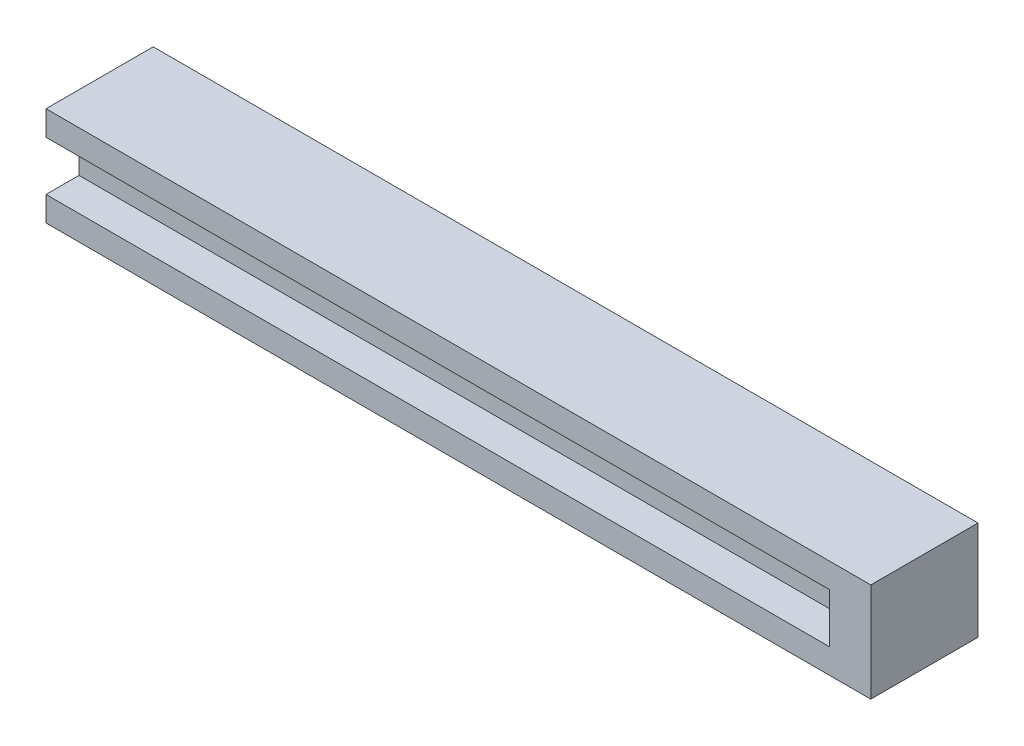
ISO-10303-21;
HEADER;
FILE_DESCRIPTION(('STEP AP214'),'2;1');
FILE_NAME('part.step','',(''),(''),'','','');
FILE_SCHEMA(('AUTOMOTIVE_DESIGN { 1 0 10303 214 1 1 1 1 }'));
ENDSEC;
DATA;
#1=APPLICATION_CONTEXT('core data for automotive mechanical design processes');
#2=APPLICATION_PROTOCOL_DEFINITION('international standard','automotive_design',2000,#1);
#3=PRODUCT_CONTEXT('',#1,'mechanical');
#4=PRODUCT('Part','Part','',(#3));
#5=PRODUCT_RELATED_PRODUCT_CATEGORY('part','',(#4));
#6=PRODUCT_DEFINITION_FORMATION('','',#4);
#7=PRODUCT_DEFINITION_CONTEXT('part definition',#1,'design');
#8=PRODUCT_DEFINITION('design','',#6,#7);
#9=PRODUCT_DEFINITION_SHAPE('','',#8);
#10=(LENGTH_UNIT() NAMED_UNIT(*) SI_UNIT(.MILLI.,.METRE.));
#11=(NAMED_UNIT(*) PLANE_ANGLE_UNIT() SI_UNIT($,.RADIAN.));
#12=(NAMED_UNIT(*) SI_UNIT($,.STERADIAN.) SOLID_ANGLE_UNIT());
#13=UNCERTAINTY_MEASURE_WITH_UNIT(LENGTH_MEASURE(1.E-05),#10,'distance_accuracy_value','');
#14=(GEOMETRIC_REPRESENTATION_CONTEXT(3) GLOBAL_UNCERTAINTY_ASSIGNED_CONTEXT((#13)) GLOBAL_UNIT_ASSIGNED_CONTEXT((#10,
#11,#12)) REPRESENTATION_CONTEXT('',''));
#15=CARTESIAN_POINT('',(0.,0.,0.));
#16=DIRECTION('',(0.,0.,1.));
#17=DIRECTION('',(1.,0.,0.));
#18=AXIS2_PLACEMENT_3D('',#15,#16,#17);
#19=CARTESIAN_POINT('',(0.,0.,0.));
#20=DIRECTION('',(0.,0.,1.));
#21=DIRECTION('',(1.,0.,0.));
#22=AXIS2_PLACEMENT_3D('',#19,#20,#21);
#23=PLANE('',#22);
#24=DIRECTION('',(-1.,0.,0.));
#25=VECTOR('',#24,1.);
#26=CARTESIAN_POINT('',(45.,2.99999999999999,0.));
#27=LINE('',#26,#25);
#28=CARTESIAN_POINT('',(45.,2.99999999999999,0.));
#29=VERTEX_POINT('',#28);
#30=CARTESIAN_POINT('',(-50.,2.99999999999999,0.));
#31=VERTEX_POINT('',#30);
#32=EDGE_CURVE('E57',#29,#31,#27,.T.);
#33=ORIENTED_EDGE('',*,*,#32,.F.);
#34=DIRECTION('',(0.,1.,0.));
#35=VECTOR('',#34,1.);
#36=CARTESIAN_POINT('',(45.,-3.,0.));
#37=LINE('',#36,#35);
#38=CARTESIAN_POINT('',(45.,-3.,0.));
#39=VERTEX_POINT('',#38);
#40=EDGE_CURVE('E257',#39,#29,#37,.T.);
#41=ORIENTED_EDGE('',*,*,#40,.F.);
#42=DIRECTION('',(1.,0.,0.));
#43=VECTOR('',#42,1.);
#44=CARTESIAN_POINT('',(-50.,-3.,0.));
#45=LINE('',#44,#43);
#46=CARTESIAN_POINT('',(-50.,-3.,0.));
#47=VERTEX_POINT('',#46);
#48=EDGE_CURVE('E62',#47,#39,#45,.T.);
#49=ORIENTED_EDGE('',*,*,#48,.F.);
#50=DIRECTION('',(0.,-1.,0.));
#51=VECTOR('',#50,1.);
#52=CARTESIAN_POINT('',(-50.,6.,0.));
#53=LINE('',#52,#51);
#54=EDGE_CURVE('E153',#31,#47,#53,.T.);
#55=ORIENTED_EDGE('',*,*,#54,.F.);
#56=EDGE_LOOP('',(#33,#41,#49,#55));
#57=FACE_BOUND('',#56,.T.);
#58=ADVANCED_FACE('F41',(#57),#23,.F.);
#59=CARTESIAN_POINT('',(50.,6.,5.));
#60=DIRECTION('',(-1.,0.,0.));
#61=DIRECTION('',(0.,0.,1.));
#62=AXIS2_PLACEMENT_3D('',#59,#60,#61);
#63=PLANE('',#62);
#64=DIRECTION('',(0.,0.,-1.));
#65=VECTOR('',#64,1.);
#66=CARTESIAN_POINT('',(50.,-6.,5.));
#67=LINE('',#66,#65);
#68=CARTESIAN_POINT('',(50.,-6.,9.));
#69=VERTEX_POINT('',#68);
#70=CARTESIAN_POINT('',(50.,-6.,-4.));
#71=VERTEX_POINT('',#70);
#72=EDGE_CURVE('E220',#69,#71,#67,.T.);
#73=ORIENTED_EDGE('',*,*,#72,.T.);
#74=DIRECTION('',(0.,-1.,0.));
#75=VECTOR('',#74,1.);
#76=CARTESIAN_POINT('',(50.,6.,-4.));
#77=LINE('',#76,#75);
#78=CARTESIAN_POINT('',(50.,6.,-4.));
#79=VERTEX_POINT('',#78);
#80=EDGE_CURVE('E246',#79,#71,#77,.T.);
#81=ORIENTED_EDGE('',*,*,#80,.F.);
#82=DIRECTION('',(0.,0.,-1.));
#83=VECTOR('',#82,1.);
#84=CARTESIAN_POINT('',(50.,6.,5.));
#85=LINE('',#84,#83);
#86=CARTESIAN_POINT('',(50.,6.,9.));
#87=VERTEX_POINT('',#86);
#88=EDGE_CURVE('E11',#87,#79,#85,.T.);
#89=ORIENTED_EDGE('',*,*,#88,.F.);
#90=DIRECTION('',(0.,1.,0.));
#91=VECTOR('',#90,1.);
#92=CARTESIAN_POINT('',(50.,-6.,9.));
#93=LINE('',#92,#91);
#94=EDGE_CURVE('E170',#69,#87,#93,.T.);
#95=ORIENTED_EDGE('',*,*,#94,.F.);
#96=EDGE_LOOP('',(#73,#81,#89,#95));
#97=FACE_BOUND('',#96,.T.);
#98=ADVANCED_FACE('F43',(#97),#63,.F.);
#99=CARTESIAN_POINT('',(-50.,6.,5.));
#100=DIRECTION('',(0.,-1.,0.));
#101=DIRECTION('',(0.,0.,-1.));
#102=AXIS2_PLACEMENT_3D('',#99,#100,#101);
#103=PLANE('',#102);
#104=ORIENTED_EDGE('',*,*,#88,.T.);
#105=DIRECTION('',(1.,0.,0.));
#106=VECTOR('',#105,1.);
#107=CARTESIAN_POINT('',(-50.,6.,-4.));
#108=LINE('',#107,#106);
#109=CARTESIAN_POINT('',(-50.,6.,-4.));
#110=VERTEX_POINT('',#109);
#111=EDGE_CURVE('E237',#110,#79,#108,.T.);
#112=ORIENTED_EDGE('',*,*,#111,.F.);
#113=DIRECTION('',(0.,0.,-1.));
#114=VECTOR('',#113,1.);
#115=CARTESIAN_POINT('',(-50.,6.,5.));
#116=LINE('',#115,#114);
#117=CARTESIAN_POINT('',(-50.,6.,9.));
#118=VERTEX_POINT('',#117);
#119=EDGE_CURVE('E50',#118,#110,#116,.T.);
#120=ORIENTED_EDGE('',*,*,#119,.F.);
#121=DIRECTION('',(-1.,0.,0.));
#122=VECTOR('',#121,1.);
#123=CARTESIAN_POINT('',(50.,6.,9.));
#124=LINE('',#123,#122);
#125=EDGE_CURVE('E175',#87,#118,#124,.T.);
#126=ORIENTED_EDGE('',*,*,#125,.F.);
#127=EDGE_LOOP('',(#104,#112,#120,#126));
#128=FACE_BOUND('',#127,.T.);
#129=ADVANCED_FACE('F244',(#128),#103,.F.);
#130=CARTESIAN_POINT('',(-50.,6.,5.));
#131=DIRECTION('',(1.,0.,0.));
#132=DIRECTION('',(0.,0.,-1.));
#133=AXIS2_PLACEMENT_3D('',#130,#131,#132);
#134=PLANE('',#133);
#135=ORIENTED_EDGE('',*,*,#119,.T.);
#136=DIRECTION('',(0.,1.,0.));
#137=VECTOR('',#136,1.);
#138=CARTESIAN_POINT('',(-50.,2.99999999999999,-4.));
#139=LINE('',#138,#137);
#140=CARTESIAN_POINT('',(-50.,2.99999999999999,-4.));
#141=VERTEX_POINT('',#140);
#142=EDGE_CURVE('E231',#141,#110,#139,.T.);
#143=ORIENTED_EDGE('',*,*,#142,.F.);
#144=DIRECTION('',(0.,0.,1.));
#145=VECTOR('',#144,1.);
#146=CARTESIAN_POINT('',(-50.,2.99999999999999,-4.));
#147=LINE('',#146,#145);
#148=EDGE_CURVE('E254',#141,#31,#147,.T.);
#149=ORIENTED_EDGE('',*,*,#148,.T.);
#150=ORIENTED_EDGE('',*,*,#54,.T.);
#151=DIRECTION('',(0.,0.,1.));
#152=VECTOR('',#151,1.);
#153=CARTESIAN_POINT('',(-50.,-3.,-4.));
#154=LINE('',#153,#152);
#155=CARTESIAN_POINT('',(-50.,-3.,-4.));
#156=VERTEX_POINT('',#155);
#157=EDGE_CURVE('E133',#156,#47,#154,.T.);
#158=ORIENTED_EDGE('',*,*,#157,.F.);
#159=DIRECTION('',(0.,1.,0.));
#160=VECTOR('',#159,1.);
#161=CARTESIAN_POINT('',(-50.,-6.,-4.));
#162=LINE('',#161,#160);
#163=CARTESIAN_POINT('',(-50.,-6.,-4.));
#164=VERTEX_POINT('',#163);
#165=EDGE_CURVE('E140',#164,#156,#162,.T.);
#166=ORIENTED_EDGE('',*,*,#165,.F.);
#167=DIRECTION('',(0.,0.,-1.));
#168=VECTOR('',#167,1.);
#169=CARTESIAN_POINT('',(-50.,-6.,5.));
#170=LINE('',#169,#168);
#171=CARTESIAN_POINT('',(-50.,-6.,9.));
#172=VERTEX_POINT('',#171);
#173=EDGE_CURVE('E225',#172,#164,#170,.T.);
#174=ORIENTED_EDGE('',*,*,#173,.F.);
#175=DIRECTION('',(0.,-1.,0.));
#176=VECTOR('',#175,1.);
#177=CARTESIAN_POINT('',(-50.,-3.,9.));
#178=LINE('',#177,#176);
#179=CARTESIAN_POINT('',(-50.,-3.,9.));
#180=VERTEX_POINT('',#179);
#181=EDGE_CURVE('E191',#180,#172,#178,.T.);
#182=ORIENTED_EDGE('',*,*,#181,.F.);
#183=DIRECTION('',(0.,0.,-1.));
#184=VECTOR('',#183,1.);
#185=CARTESIAN_POINT('',(-50.,-3.,9.));
#186=LINE('',#185,#184);
#187=CARTESIAN_POINT('',(-50.,-3.,5.));
#188=VERTEX_POINT('',#187);
#189=EDGE_CURVE('E194',#180,#188,#186,.T.);
#190=ORIENTED_EDGE('',*,*,#189,.T.);
#191=DIRECTION('',(0.,-1.,0.));
#192=VECTOR('',#191,1.);
#193=CARTESIAN_POINT('',(-50.,6.,5.));
#194=LINE('',#193,#192);
#195=CARTESIAN_POINT('',(-50.,2.99999999999999,5.));
#196=VERTEX_POINT('',#195);
#197=EDGE_CURVE('E217',#196,#188,#194,.T.);
#198=ORIENTED_EDGE('',*,*,#197,.F.);
#199=DIRECTION('',(0.,0.,-1.));
#200=VECTOR('',#199,1.);
#201=CARTESIAN_POINT('',(-50.,2.99999999999999,9.));
#202=LINE('',#201,#200);
#203=CARTESIAN_POINT('',(-50.,2.99999999999999,9.));
#204=VERTEX_POINT('',#203);
#205=EDGE_CURVE('E213',#204,#196,#202,.T.);
#206=ORIENTED_EDGE('',*,*,#205,.F.);
#207=DIRECTION('',(0.,-1.,0.));
#208=VECTOR('',#207,1.);
#209=CARTESIAN_POINT('',(-50.,6.,9.));
#210=LINE('',#209,#208);
#211=EDGE_CURVE('E179',#118,#204,#210,.T.);
#212=ORIENTED_EDGE('',*,*,#211,.F.);
#213=EDGE_LOOP('',(#135,#143,#149,#150,#158,#166,#174,#182,#190,#198,#206,#212));
#214=FACE_BOUND('',#213,.T.);
#215=ADVANCED_FACE('F151',(#214),#134,.F.);
#216=CARTESIAN_POINT('',(-50.,-6.,5.));
#217=DIRECTION('',(0.,1.,0.));
#218=DIRECTION('',(0.,0.,1.));
#219=AXIS2_PLACEMENT_3D('',#216,#217,#218);
#220=PLANE('',#219);
#221=ORIENTED_EDGE('',*,*,#173,.T.);
#222=DIRECTION('',(-1.,0.,0.));
#223=VECTOR('',#222,1.);
#224=CARTESIAN_POINT('',(50.,-6.,-4.));
#225=LINE('',#224,#223);
#226=EDGE_CURVE('E147',#71,#164,#225,.T.);
#227=ORIENTED_EDGE('',*,*,#226,.F.);
#228=ORIENTED_EDGE('',*,*,#72,.F.);
#229=DIRECTION('',(1.,0.,0.));
#230=VECTOR('',#229,1.);
#231=CARTESIAN_POINT('',(-50.,-6.,9.));
#232=LINE('',#231,#230);
#233=EDGE_CURVE('E166',#172,#69,#232,.T.);
#234=ORIENTED_EDGE('',*,*,#233,.F.);
#235=EDGE_LOOP('',(#221,#227,#228,#234));
#236=FACE_BOUND('',#235,.T.);
#237=ADVANCED_FACE('F282',(#236),#220,.F.);
#238=CARTESIAN_POINT('',(0.,0.,5.));
#239=DIRECTION('',(0.,0.,1.));
#240=DIRECTION('',(1.,0.,0.));
#241=AXIS2_PLACEMENT_3D('',#238,#239,#240);
#242=PLANE('',#241);
#243=DIRECTION('',(-1.,0.,0.));
#244=VECTOR('',#243,1.);
#245=CARTESIAN_POINT('',(-50.,-3.,5.));
#246=LINE('',#245,#244);
#247=CARTESIAN_POINT('',(45.,-3.,5.));
#248=VERTEX_POINT('',#247);
#249=EDGE_CURVE('E171',#248,#188,#246,.T.);
#250=ORIENTED_EDGE('',*,*,#249,.F.);
#251=DIRECTION('',(0.,-1.,0.));
#252=VECTOR('',#251,1.);
#253=CARTESIAN_POINT('',(45.,2.99999999999999,5.));
#254=LINE('',#253,#252);
#255=CARTESIAN_POINT('',(45.,2.99999999999999,5.));
#256=VERTEX_POINT('',#255);
#257=EDGE_CURVE('E160',#256,#248,#254,.T.);
#258=ORIENTED_EDGE('',*,*,#257,.F.);
#259=DIRECTION('',(1.,0.,0.));
#260=VECTOR('',#259,1.);
#261=CARTESIAN_POINT('',(-50.,2.99999999999999,5.));
#262=LINE('',#261,#260);
#263=EDGE_CURVE('E155',#196,#256,#262,.T.);
#264=ORIENTED_EDGE('',*,*,#263,.F.);
#265=ORIENTED_EDGE('',*,*,#197,.T.);
#266=EDGE_LOOP('',(#250,#258,#264,#265));
#267=FACE_BOUND('',#266,.T.);
#268=ADVANCED_FACE('F280',(#267),#242,.T.);
#269=CARTESIAN_POINT('',(-50.,2.99999999999999,9.));
#270=DIRECTION('',(0.,1.,0.));
#271=DIRECTION('',(0.,0.,1.));
#272=AXIS2_PLACEMENT_3D('',#269,#270,#271);
#273=PLANE('',#272);
#274=ORIENTED_EDGE('',*,*,#263,.T.);
#275=DIRECTION('',(0.,0.,-1.));
#276=VECTOR('',#275,1.);
#277=CARTESIAN_POINT('',(45.,2.99999999999999,9.));
#278=LINE('',#277,#276);
#279=CARTESIAN_POINT('',(45.,2.99999999999999,9.));
#280=VERTEX_POINT('',#279);
#281=EDGE_CURVE('E209',#280,#256,#278,.T.);
#282=ORIENTED_EDGE('',*,*,#281,.F.);
#283=DIRECTION('',(1.,0.,0.));
#284=VECTOR('',#283,1.);
#285=CARTESIAN_POINT('',(-50.,2.99999999999999,9.));
#286=LINE('',#285,#284);
#287=EDGE_CURVE('E182',#204,#280,#286,.T.);
#288=ORIENTED_EDGE('',*,*,#287,.F.);
#289=ORIENTED_EDGE('',*,*,#205,.T.);
#290=EDGE_LOOP('',(#274,#282,#288,#289));
#291=FACE_BOUND('',#290,.T.);
#292=ADVANCED_FACE('F391',(#291),#273,.F.);
#293=CARTESIAN_POINT('',(45.,2.99999999999999,9.));
#294=DIRECTION('',(1.,0.,0.));
#295=DIRECTION('',(0.,1.,0.));
#296=AXIS2_PLACEMENT_3D('',#293,#294,#295);
#297=PLANE('',#296);
#298=ORIENTED_EDGE('',*,*,#257,.T.);
#299=DIRECTION('',(0.,0.,-1.));
#300=VECTOR('',#299,1.);
#301=CARTESIAN_POINT('',(45.,-3.,9.));
#302=LINE('',#301,#300);
#303=CARTESIAN_POINT('',(45.,-3.,9.));
#304=VERTEX_POINT('',#303);
#305=EDGE_CURVE('E205',#304,#248,#302,.T.);
#306=ORIENTED_EDGE('',*,*,#305,.F.);
#307=DIRECTION('',(0.,-1.,0.));
#308=VECTOR('',#307,1.);
#309=CARTESIAN_POINT('',(45.,2.99999999999999,9.));
#310=LINE('',#309,#308);
#311=EDGE_CURVE('E185',#280,#304,#310,.T.);
#312=ORIENTED_EDGE('',*,*,#311,.F.);
#313=ORIENTED_EDGE('',*,*,#281,.T.);
#314=EDGE_LOOP('',(#298,#306,#312,#313));
#315=FACE_BOUND('',#314,.T.);
#316=ADVANCED_FACE('F383',(#315),#297,.F.);
#317=CARTESIAN_POINT('',(-50.,-3.,9.));
#318=DIRECTION('',(0.,-1.,0.));
#319=DIRECTION('',(0.,0.,-1.));
#320=AXIS2_PLACEMENT_3D('',#317,#318,#319);
#321=PLANE('',#320);
#322=ORIENTED_EDGE('',*,*,#249,.T.);
#323=ORIENTED_EDGE('',*,*,#189,.F.);
#324=DIRECTION('',(-1.,0.,0.));
#325=VECTOR('',#324,1.);
#326=CARTESIAN_POINT('',(-50.,-3.,9.));
#327=LINE('',#326,#325);
#328=EDGE_CURVE('E188',#304,#180,#327,.T.);
#329=ORIENTED_EDGE('',*,*,#328,.F.);
#330=ORIENTED_EDGE('',*,*,#305,.T.);
#331=EDGE_LOOP('',(#322,#323,#329,#330));
#332=FACE_BOUND('',#331,.T.);
#333=ADVANCED_FACE('F374',(#332),#321,.F.);
#334=CARTESIAN_POINT('',(0.,0.,9.));
#335=DIRECTION('',(0.,0.,1.));
#336=DIRECTION('',(1.,0.,0.));
#337=AXIS2_PLACEMENT_3D('',#334,#335,#336);
#338=PLANE('',#337);
#339=ORIENTED_EDGE('',*,*,#233,.T.);
#340=ORIENTED_EDGE('',*,*,#94,.T.);
#341=ORIENTED_EDGE('',*,*,#125,.T.);
#342=ORIENTED_EDGE('',*,*,#211,.T.);
#343=ORIENTED_EDGE('',*,*,#287,.T.);
#344=ORIENTED_EDGE('',*,*,#311,.T.);
#345=ORIENTED_EDGE('',*,*,#328,.T.);
#346=ORIENTED_EDGE('',*,*,#181,.T.);
#347=EDGE_LOOP('',(#339,#340,#341,#342,#343,#344,#345,#346));
#348=FACE_BOUND('',#347,.T.);
#349=ADVANCED_FACE('F306',(#348),#338,.T.);
#350=CARTESIAN_POINT('',(-50.,-3.,-4.));
#351=DIRECTION('',(0.,-1.,0.));
#352=DIRECTION('',(0.,0.,-1.));
#353=AXIS2_PLACEMENT_3D('',#350,#351,#352);
#354=PLANE('',#353);
#355=ORIENTED_EDGE('',*,*,#48,.T.);
#356=DIRECTION('',(0.,0.,1.));
#357=VECTOR('',#356,1.);
#358=CARTESIAN_POINT('',(45.,-3.,-4.));
#359=LINE('',#358,#357);
#360=CARTESIAN_POINT('',(45.,-3.,-4.));
#361=VERTEX_POINT('',#360);
#362=EDGE_CURVE('E135',#361,#39,#359,.T.);
#363=ORIENTED_EDGE('',*,*,#362,.F.);
#364=DIRECTION('',(1.,0.,0.));
#365=VECTOR('',#364,1.);
#366=CARTESIAN_POINT('',(-50.,-3.,-4.));
#367=LINE('',#366,#365);
#368=EDGE_CURVE('E129',#156,#361,#367,.T.);
#369=ORIENTED_EDGE('',*,*,#368,.F.);
#370=ORIENTED_EDGE('',*,*,#157,.T.);
#371=EDGE_LOOP('',(#355,#363,#369,#370));
#372=FACE_BOUND('',#371,.T.);
#373=ADVANCED_FACE('F131',(#372),#354,.F.);
#374=CARTESIAN_POINT('',(45.,-3.,-4.));
#375=DIRECTION('',(1.,0.,0.));
#376=DIRECTION('',(0.,1.,0.));
#377=AXIS2_PLACEMENT_3D('',#374,#375,#376);
#378=PLANE('',#377);
#379=ORIENTED_EDGE('',*,*,#40,.T.);
#380=DIRECTION('',(0.,0.,1.));
#381=VECTOR('',#380,1.);
#382=CARTESIAN_POINT('',(45.,2.99999999999999,-4.));
#383=LINE('',#382,#381);
#384=CARTESIAN_POINT('',(45.,2.99999999999999,-4.));
#385=VERTEX_POINT('',#384);
#386=EDGE_CURVE('E162',#385,#29,#383,.T.);
#387=ORIENTED_EDGE('',*,*,#386,.F.);
#388=DIRECTION('',(0.,1.,0.));
#389=VECTOR('',#388,1.);
#390=CARTESIAN_POINT('',(45.,-3.,-4.));
#391=LINE('',#390,#389);
#392=EDGE_CURVE('E139',#361,#385,#391,.T.);
#393=ORIENTED_EDGE('',*,*,#392,.F.);
#394=ORIENTED_EDGE('',*,*,#362,.T.);
#395=EDGE_LOOP('',(#379,#387,#393,#394));
#396=FACE_BOUND('',#395,.T.);
#397=ADVANCED_FACE('F269',(#396),#378,.F.);
#398=CARTESIAN_POINT('',(45.,2.99999999999999,-4.));
#399=DIRECTION('',(0.,1.,0.));
#400=DIRECTION('',(0.,0.,1.));
#401=AXIS2_PLACEMENT_3D('',#398,#399,#400);
#402=PLANE('',#401);
#403=ORIENTED_EDGE('',*,*,#32,.T.);
#404=ORIENTED_EDGE('',*,*,#148,.F.);
#405=DIRECTION('',(-1.,0.,0.));
#406=VECTOR('',#405,1.);
#407=CARTESIAN_POINT('',(45.,2.99999999999999,-4.));
#408=LINE('',#407,#406);
#409=EDGE_CURVE('E240',#385,#141,#408,.T.);
#410=ORIENTED_EDGE('',*,*,#409,.F.);
#411=ORIENTED_EDGE('',*,*,#386,.T.);
#412=EDGE_LOOP('',(#403,#404,#410,#411));
#413=FACE_BOUND('',#412,.T.);
#414=ADVANCED_FACE('F267',(#413),#402,.F.);
#415=CARTESIAN_POINT('',(0.,0.,-4.));
#416=DIRECTION('',(0.,0.,-1.));
#417=DIRECTION('',(-1.,0.,0.));
#418=AXIS2_PLACEMENT_3D('',#415,#416,#417);
#419=PLANE('',#418);
#420=ORIENTED_EDGE('',*,*,#165,.T.);
#421=ORIENTED_EDGE('',*,*,#368,.T.);
#422=ORIENTED_EDGE('',*,*,#392,.T.);
#423=ORIENTED_EDGE('',*,*,#409,.T.);
#424=ORIENTED_EDGE('',*,*,#142,.T.);
#425=ORIENTED_EDGE('',*,*,#111,.T.);
#426=ORIENTED_EDGE('',*,*,#80,.T.);
#427=ORIENTED_EDGE('',*,*,#226,.T.);
#428=EDGE_LOOP('',(#420,#421,#422,#423,#424,#425,#426,#427));
#429=FACE_BOUND('',#428,.T.);
#430=ADVANCED_FACE('F144',(#429),#419,.T.);
#431=CLOSED_SHELL('',(#58,#98,#129,#215,#237,#268,#292,#316,#333,#349,#373,#397,#414,#430));
#432=MANIFOLD_SOLID_BREP('B2',#431);
#433=ADVANCED_BREP_SHAPE_REPRESENTATION('',(#18,#432),#14);
#434=SHAPE_DEFINITION_REPRESENTATION(#9,#433);
ENDSEC;
END-ISO-10303-21;
